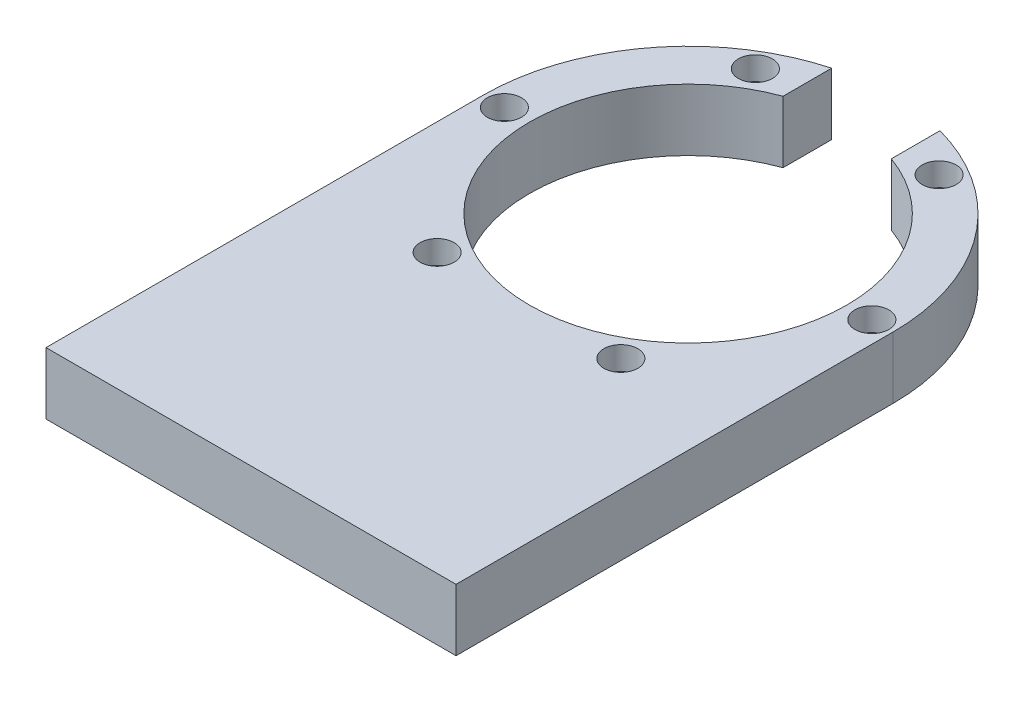
ISO-10303-21;
HEADER;
FILE_DESCRIPTION(('STEP AP214'),'2;1');
FILE_NAME('part.step','',(''),(''),'','','');
FILE_SCHEMA(('AUTOMOTIVE_DESIGN { 1 0 10303 214 1 1 1 1 }'));
ENDSEC;
DATA;
#1=APPLICATION_CONTEXT('core data for automotive mechanical design processes');
#2=APPLICATION_PROTOCOL_DEFINITION('international standard','automotive_design',2000,#1);
#3=PRODUCT_CONTEXT('',#1,'mechanical');
#4=PRODUCT('Part','Part','',(#3));
#5=PRODUCT_RELATED_PRODUCT_CATEGORY('part','',(#4));
#6=PRODUCT_DEFINITION_FORMATION('','',#4);
#7=PRODUCT_DEFINITION_CONTEXT('part definition',#1,'design');
#8=PRODUCT_DEFINITION('design','',#6,#7);
#9=PRODUCT_DEFINITION_SHAPE('','',#8);
#10=(LENGTH_UNIT() NAMED_UNIT(*) SI_UNIT(.MILLI.,.METRE.));
#11=(NAMED_UNIT(*) PLANE_ANGLE_UNIT() SI_UNIT($,.RADIAN.));
#12=(NAMED_UNIT(*) SI_UNIT($,.STERADIAN.) SOLID_ANGLE_UNIT());
#13=UNCERTAINTY_MEASURE_WITH_UNIT(LENGTH_MEASURE(1.E-05),#10,'distance_accuracy_value','');
#14=(GEOMETRIC_REPRESENTATION_CONTEXT(3) GLOBAL_UNCERTAINTY_ASSIGNED_CONTEXT((#13)) GLOBAL_UNIT_ASSIGNED_CONTEXT((#10,
#11,#12)) REPRESENTATION_CONTEXT('',''));
#15=CARTESIAN_POINT('',(0.,0.,0.));
#16=DIRECTION('',(0.,0.,1.));
#17=DIRECTION('',(1.,0.,0.));
#18=AXIS2_PLACEMENT_3D('',#15,#16,#17);
#19=CARTESIAN_POINT('',(11.875,0.,20.5681033398804));
#20=DIRECTION('',(0.,1.,0.));
#21=DIRECTION('',(0.,0.,1.));
#22=AXIS2_PLACEMENT_3D('',#19,#20,#21);
#23=CYLINDRICAL_SURFACE('',#22,1.25);
#24=CARTESIAN_POINT('',(11.875,0.,20.5681033398804));
#25=DIRECTION('',(0.,1.,0.));
#26=DIRECTION('',(0.,0.,1.));
#27=AXIS2_PLACEMENT_3D('',#24,#25,#26);
#28=CIRCLE('',#27,1.25);
#29=CARTESIAN_POINT('',(11.875,0.,21.8181033398804));
#30=VERTEX_POINT('',#29);
#31=EDGE_CURVE('E204',#30,#30,#28,.T.);
#32=ORIENTED_EDGE('',*,*,#31,.F.);
#33=EDGE_LOOP('',(#32));
#34=FACE_BOUND('',#33,.T.);
#35=CARTESIAN_POINT('',(11.875,5.,20.5681033398804));
#36=DIRECTION('',(0.,1.,0.));
#37=DIRECTION('',(0.,0.,1.));
#38=AXIS2_PLACEMENT_3D('',#35,#36,#37);
#39=CIRCLE('',#38,1.25);
#40=CARTESIAN_POINT('',(11.875,5.,21.8181033398804));
#41=VERTEX_POINT('',#40);
#42=EDGE_CURVE('E45',#41,#41,#39,.F.);
#43=ORIENTED_EDGE('',*,*,#42,.F.);
#44=EDGE_LOOP('',(#43));
#45=FACE_BOUND('',#44,.T.);
#46=ADVANCED_FACE('F41',(#34,#45),#23,.F.);
#47=CARTESIAN_POINT('',(-11.8750000000001,0.,20.5681033398804));
#48=DIRECTION('',(0.,1.,0.));
#49=DIRECTION('',(0.,0.,1.));
#50=AXIS2_PLACEMENT_3D('',#47,#48,#49);
#51=CYLINDRICAL_SURFACE('',#50,1.25);
#52=CARTESIAN_POINT('',(-11.8750000000001,0.,20.5681033398804));
#53=DIRECTION('',(0.,1.,0.));
#54=DIRECTION('',(0.,0.,1.));
#55=AXIS2_PLACEMENT_3D('',#52,#53,#54);
#56=CIRCLE('',#55,1.25);
#57=CARTESIAN_POINT('',(-11.8750000000001,0.,21.8181033398804));
#58=VERTEX_POINT('',#57);
#59=EDGE_CURVE('E207',#58,#58,#56,.T.);
#60=ORIENTED_EDGE('',*,*,#59,.F.);
#61=EDGE_LOOP('',(#60));
#62=FACE_BOUND('',#61,.T.);
#63=CARTESIAN_POINT('',(-11.8750000000001,5.,20.5681033398804));
#64=DIRECTION('',(0.,1.,0.));
#65=DIRECTION('',(0.,0.,1.));
#66=AXIS2_PLACEMENT_3D('',#63,#64,#65);
#67=CIRCLE('',#66,1.25);
#68=CARTESIAN_POINT('',(-11.8750000000001,5.,21.8181033398804));
#69=VERTEX_POINT('',#68);
#70=EDGE_CURVE('E187',#69,#69,#67,.F.);
#71=ORIENTED_EDGE('',*,*,#70,.F.);
#72=EDGE_LOOP('',(#71));
#73=FACE_BOUND('',#72,.T.);
#74=ADVANCED_FACE('F218',(#62,#73),#51,.F.);
#75=CARTESIAN_POINT('',(-23.75,0.,-1.65845363595049E-13));
#76=DIRECTION('',(0.,1.,0.));
#77=DIRECTION('',(0.,0.,1.));
#78=AXIS2_PLACEMENT_3D('',#75,#76,#77);
#79=CYLINDRICAL_SURFACE('',#78,1.25);
#80=CARTESIAN_POINT('',(-23.75,0.,-1.65845363595049E-13));
#81=DIRECTION('',(0.,1.,0.));
#82=DIRECTION('',(0.,0.,1.));
#83=AXIS2_PLACEMENT_3D('',#80,#81,#82);
#84=CIRCLE('',#83,1.25);
#85=CARTESIAN_POINT('',(-23.75,0.,1.24999999999984));
#86=VERTEX_POINT('',#85);
#87=EDGE_CURVE('E200',#86,#86,#84,.T.);
#88=ORIENTED_EDGE('',*,*,#87,.F.);
#89=EDGE_LOOP('',(#88));
#90=FACE_BOUND('',#89,.T.);
#91=CARTESIAN_POINT('',(-23.75,5.,-1.65845363595049E-13));
#92=DIRECTION('',(0.,1.,0.));
#93=DIRECTION('',(0.,0.,1.));
#94=AXIS2_PLACEMENT_3D('',#91,#92,#93);
#95=CIRCLE('',#94,1.25);
#96=CARTESIAN_POINT('',(-23.75,5.,1.24999999999984));
#97=VERTEX_POINT('',#96);
#98=EDGE_CURVE('E185',#97,#97,#95,.F.);
#99=ORIENTED_EDGE('',*,*,#98,.F.);
#100=EDGE_LOOP('',(#99));
#101=FACE_BOUND('',#100,.T.);
#102=ADVANCED_FACE('F214',(#90,#101),#79,.F.);
#103=CARTESIAN_POINT('',(-11.8749999999998,0.,-20.5681033398805));
#104=DIRECTION('',(0.,1.,0.));
#105=DIRECTION('',(0.,0.,1.));
#106=AXIS2_PLACEMENT_3D('',#103,#104,#105);
#107=CYLINDRICAL_SURFACE('',#106,1.25);
#108=CARTESIAN_POINT('',(-11.8749999999998,0.,-20.5681033398805));
#109=DIRECTION('',(0.,1.,0.));
#110=DIRECTION('',(0.,0.,1.));
#111=AXIS2_PLACEMENT_3D('',#108,#109,#110);
#112=CIRCLE('',#111,1.25);
#113=CARTESIAN_POINT('',(-11.8749999999998,0.,-19.3181033398805));
#114=VERTEX_POINT('',#113);
#115=EDGE_CURVE('E140',#114,#114,#112,.T.);
#116=ORIENTED_EDGE('',*,*,#115,.F.);
#117=EDGE_LOOP('',(#116));
#118=FACE_BOUND('',#117,.T.);
#119=CARTESIAN_POINT('',(-11.8749999999998,5.,-20.5681033398805));
#120=DIRECTION('',(0.,1.,0.));
#121=DIRECTION('',(0.,0.,1.));
#122=AXIS2_PLACEMENT_3D('',#119,#120,#121);
#123=CIRCLE('',#122,1.25);
#124=CARTESIAN_POINT('',(-11.8749999999998,5.,-19.3181033398805));
#125=VERTEX_POINT('',#124);
#126=EDGE_CURVE('E182',#125,#125,#123,.F.);
#127=ORIENTED_EDGE('',*,*,#126,.F.);
#128=EDGE_LOOP('',(#127));
#129=FACE_BOUND('',#128,.T.);
#130=ADVANCED_FACE('F217',(#118,#129),#107,.F.);
#131=CARTESIAN_POINT('',(11.8750000000002,0.,-20.5681033398803));
#132=DIRECTION('',(0.,1.,0.));
#133=DIRECTION('',(0.,0.,1.));
#134=AXIS2_PLACEMENT_3D('',#131,#132,#133);
#135=CYLINDRICAL_SURFACE('',#134,1.25);
#136=CARTESIAN_POINT('',(11.8750000000002,0.,-20.5681033398803));
#137=DIRECTION('',(0.,1.,0.));
#138=DIRECTION('',(0.,0.,1.));
#139=AXIS2_PLACEMENT_3D('',#136,#137,#138);
#140=CIRCLE('',#139,1.25);
#141=CARTESIAN_POINT('',(11.8750000000002,0.,-19.3181033398803));
#142=VERTEX_POINT('',#141);
#143=EDGE_CURVE('E192',#142,#142,#140,.T.);
#144=ORIENTED_EDGE('',*,*,#143,.F.);
#145=EDGE_LOOP('',(#144));
#146=FACE_BOUND('',#145,.T.);
#147=CARTESIAN_POINT('',(11.8750000000002,5.,-20.5681033398803));
#148=DIRECTION('',(0.,1.,0.));
#149=DIRECTION('',(0.,0.,1.));
#150=AXIS2_PLACEMENT_3D('',#147,#148,#149);
#151=CIRCLE('',#150,1.25);
#152=CARTESIAN_POINT('',(11.8750000000002,5.,-19.3181033398803));
#153=VERTEX_POINT('',#152);
#154=EDGE_CURVE('E178',#153,#153,#151,.F.);
#155=ORIENTED_EDGE('',*,*,#154,.F.);
#156=EDGE_LOOP('',(#155));
#157=FACE_BOUND('',#156,.T.);
#158=ADVANCED_FACE('F251',(#146,#157),#135,.F.);
#159=CARTESIAN_POINT('',(23.75,0.,0.));
#160=DIRECTION('',(0.,1.,0.));
#161=DIRECTION('',(0.,0.,1.));
#162=AXIS2_PLACEMENT_3D('',#159,#160,#161);
#163=CYLINDRICAL_SURFACE('',#162,1.25);
#164=CARTESIAN_POINT('',(23.75,0.,0.));
#165=DIRECTION('',(0.,1.,0.));
#166=DIRECTION('',(0.,0.,1.));
#167=AXIS2_PLACEMENT_3D('',#164,#165,#166);
#168=CIRCLE('',#167,1.25);
#169=CARTESIAN_POINT('',(23.75,0.,1.25));
#170=VERTEX_POINT('',#169);
#171=EDGE_CURVE('E147',#170,#170,#168,.T.);
#172=ORIENTED_EDGE('',*,*,#171,.F.);
#173=EDGE_LOOP('',(#172));
#174=FACE_BOUND('',#173,.T.);
#175=CARTESIAN_POINT('',(23.75,5.,0.));
#176=DIRECTION('',(0.,1.,0.));
#177=DIRECTION('',(0.,0.,1.));
#178=AXIS2_PLACEMENT_3D('',#175,#176,#177);
#179=CIRCLE('',#178,1.25);
#180=CARTESIAN_POINT('',(23.75,5.,1.25));
#181=VERTEX_POINT('',#180);
#182=EDGE_CURVE('E175',#181,#181,#179,.F.);
#183=ORIENTED_EDGE('',*,*,#182,.F.);
#184=EDGE_LOOP('',(#183));
#185=FACE_BOUND('',#184,.T.);
#186=ADVANCED_FACE('F304',(#174,#185),#163,.F.);
#187=CARTESIAN_POINT('',(0.,8.,0.));
#188=DIRECTION('',(0.,-1.,0.));
#189=DIRECTION('',(0.,0.,-1.));
#190=AXIS2_PLACEMENT_3D('',#187,#188,#189);
#191=CYLINDRICAL_SURFACE('',#190,26.5);
#192=DIRECTION('',(0.,1.,0.));
#193=VECTOR('',#192,1.);
#194=CARTESIAN_POINT('',(-26.5,0.,1.85048510958686E-13));
#195=LINE('',#194,#193);
#196=CARTESIAN_POINT('',(-26.5,0.,0.));
#197=VERTEX_POINT('',#196);
#198=CARTESIAN_POINT('',(-26.5,8.,0.));
#199=VERTEX_POINT('',#198);
#200=EDGE_CURVE('E66',#197,#199,#195,.T.);
#201=ORIENTED_EDGE('',*,*,#200,.T.);
#202=CARTESIAN_POINT('',(0.,8.,0.));
#203=DIRECTION('',(0.,1.,0.));
#204=DIRECTION('',(0.,0.,1.));
#205=AXIS2_PLACEMENT_3D('',#202,#203,#204);
#206=CIRCLE('',#205,26.5);
#207=CARTESIAN_POINT('',(-7.,8.,-25.5587558382641));
#208=VERTEX_POINT('',#207);
#209=EDGE_CURVE('E171',#208,#199,#206,.T.);
#210=ORIENTED_EDGE('',*,*,#209,.F.);
#211=DIRECTION('',(0.,-1.,0.));
#212=VECTOR('',#211,1.);
#213=CARTESIAN_POINT('',(-7.,8.,-25.5587558382641));
#214=LINE('',#213,#212);
#215=CARTESIAN_POINT('',(-7.,0.,-25.5587558382641));
#216=VERTEX_POINT('',#215);
#217=EDGE_CURVE('E164',#208,#216,#214,.T.);
#218=ORIENTED_EDGE('',*,*,#217,.T.);
#219=CARTESIAN_POINT('',(0.,0.,0.));
#220=DIRECTION('',(0.,1.,0.));
#221=DIRECTION('',(0.,0.,1.));
#222=AXIS2_PLACEMENT_3D('',#219,#220,#221);
#223=CIRCLE('',#222,26.5);
#224=EDGE_CURVE('E119',#216,#197,#223,.T.);
#225=ORIENTED_EDGE('',*,*,#224,.T.);
#226=EDGE_LOOP('',(#201,#210,#218,#225));
#227=FACE_BOUND('',#226,.T.);
#228=ADVANCED_FACE('F306',(#227),#191,.T.);
#229=CARTESIAN_POINT('',(26.5,8.,0.));
#230=VERTEX_POINT('',#229);
#231=CARTESIAN_POINT('',(7.,8.,-25.5587558382641));
#232=VERTEX_POINT('',#231);
#233=EDGE_CURVE('E58',#230,#232,#206,.T.);
#234=ORIENTED_EDGE('',*,*,#233,.F.);
#235=DIRECTION('',(0.,1.,0.));
#236=VECTOR('',#235,1.);
#237=CARTESIAN_POINT('',(26.5,0.,0.));
#238=LINE('',#237,#236);
#239=CARTESIAN_POINT('',(26.5,0.,0.));
#240=VERTEX_POINT('',#239);
#241=EDGE_CURVE('E123',#240,#230,#238,.T.);
#242=ORIENTED_EDGE('',*,*,#241,.F.);
#243=CARTESIAN_POINT('',(7.,0.,-25.5587558382641));
#244=VERTEX_POINT('',#243);
#245=EDGE_CURVE('E109',#240,#244,#223,.T.);
#246=ORIENTED_EDGE('',*,*,#245,.T.);
#247=DIRECTION('',(0.,-1.,0.));
#248=VECTOR('',#247,1.);
#249=CARTESIAN_POINT('',(7.,8.,-25.5587558382641));
#250=LINE('',#249,#248);
#251=EDGE_CURVE('E159',#244,#232,#250,.F.);
#252=ORIENTED_EDGE('',*,*,#251,.T.);
#253=EDGE_LOOP('',(#234,#242,#246,#252));
#254=FACE_BOUND('',#253,.T.);
#255=ADVANCED_FACE('F43',(#254),#191,.T.);
#256=CARTESIAN_POINT('',(0.,8.,0.));
#257=DIRECTION('',(0.,1.,0.));
#258=DIRECTION('',(0.,0.,1.));
#259=AXIS2_PLACEMENT_3D('',#256,#257,#258);
#260=PLANE('',#259);
#261=CARTESIAN_POINT('',(23.75,8.,0.));
#262=DIRECTION('',(0.,1.,0.));
#263=DIRECTION('',(0.,0.,1.));
#264=AXIS2_PLACEMENT_3D('',#261,#262,#263);
#265=CIRCLE('',#264,2.2);
#266=CARTESIAN_POINT('',(23.75,8.,2.2));
#267=VERTEX_POINT('',#266);
#268=EDGE_CURVE('E374',#267,#267,#265,.T.);
#269=ORIENTED_EDGE('',*,*,#268,.F.);
#270=EDGE_LOOP('',(#269));
#271=FACE_BOUND('',#270,.T.);
#272=CARTESIAN_POINT('',(11.8750000000002,8.,-20.5681033398803));
#273=DIRECTION('',(0.,1.,0.));
#274=DIRECTION('',(0.,0.,1.));
#275=AXIS2_PLACEMENT_3D('',#272,#273,#274);
#276=CIRCLE('',#275,2.2);
#277=CARTESIAN_POINT('',(11.8750000000002,8.,-18.3681033398803));
#278=VERTEX_POINT('',#277);
#279=EDGE_CURVE('E364',#278,#278,#276,.T.);
#280=ORIENTED_EDGE('',*,*,#279,.F.);
#281=EDGE_LOOP('',(#280));
#282=FACE_BOUND('',#281,.T.);
#283=CARTESIAN_POINT('',(-11.8749999999998,8.,-20.5681033398805));
#284=DIRECTION('',(0.,1.,0.));
#285=DIRECTION('',(0.,0.,1.));
#286=AXIS2_PLACEMENT_3D('',#283,#284,#285);
#287=CIRCLE('',#286,2.2);
#288=CARTESIAN_POINT('',(-11.8749999999998,8.,-18.3681033398805));
#289=VERTEX_POINT('',#288);
#290=EDGE_CURVE('E361',#289,#289,#287,.T.);
#291=ORIENTED_EDGE('',*,*,#290,.F.);
#292=EDGE_LOOP('',(#291));
#293=FACE_BOUND('',#292,.T.);
#294=CARTESIAN_POINT('',(-23.75,8.,-1.65845363595049E-13));
#295=DIRECTION('',(0.,1.,0.));
#296=DIRECTION('',(0.,0.,1.));
#297=AXIS2_PLACEMENT_3D('',#294,#295,#296);
#298=CIRCLE('',#297,2.2);
#299=CARTESIAN_POINT('',(-23.75,8.,2.19999999999984));
#300=VERTEX_POINT('',#299);
#301=EDGE_CURVE('E350',#300,#300,#298,.T.);
#302=ORIENTED_EDGE('',*,*,#301,.F.);
#303=EDGE_LOOP('',(#302));
#304=FACE_BOUND('',#303,.T.);
#305=CARTESIAN_POINT('',(-11.8750000000001,8.,20.5681033398804));
#306=DIRECTION('',(0.,1.,0.));
#307=DIRECTION('',(0.,0.,1.));
#308=AXIS2_PLACEMENT_3D('',#305,#306,#307);
#309=CIRCLE('',#308,2.2);
#310=CARTESIAN_POINT('',(-11.8750000000001,8.,22.7681033398804));
#311=VERTEX_POINT('',#310);
#312=EDGE_CURVE('E349',#311,#311,#309,.T.);
#313=ORIENTED_EDGE('',*,*,#312,.F.);
#314=EDGE_LOOP('',(#313));
#315=FACE_BOUND('',#314,.T.);
#316=CARTESIAN_POINT('',(11.875,8.,20.5681033398804));
#317=DIRECTION('',(0.,1.,0.));
#318=DIRECTION('',(0.,0.,1.));
#319=AXIS2_PLACEMENT_3D('',#316,#317,#318);
#320=CIRCLE('',#319,2.2);
#321=CARTESIAN_POINT('',(11.875,8.,22.7681033398804));
#322=VERTEX_POINT('',#321);
#323=EDGE_CURVE('E377',#322,#322,#320,.T.);
#324=ORIENTED_EDGE('',*,*,#323,.F.);
#325=EDGE_LOOP('',(#324));
#326=FACE_BOUND('',#325,.T.);
#327=DIRECTION('',(0.,0.,1.));
#328=VECTOR('',#327,1.);
#329=CARTESIAN_POINT('',(-7.,8.,-27.7228900982159));
#330=LINE('',#329,#328);
#331=CARTESIAN_POINT('',(-7.,8.,-19.2678488679977));
#332=VERTEX_POINT('',#331);
#333=EDGE_CURVE('E126',#208,#332,#330,.T.);
#334=ORIENTED_EDGE('',*,*,#333,.F.);
#335=ORIENTED_EDGE('',*,*,#209,.T.);
#336=DIRECTION('',(0.,0.,1.));
#337=VECTOR('',#336,1.);
#338=CARTESIAN_POINT('',(-26.5,8.,1.85048510958686E-13));
#339=LINE('',#338,#337);
#340=CARTESIAN_POINT('',(-26.5,8.,56.5));
#341=VERTEX_POINT('',#340);
#342=EDGE_CURVE('E132',#199,#341,#339,.T.);
#343=ORIENTED_EDGE('',*,*,#342,.T.);
#344=DIRECTION('',(1.,0.,0.));
#345=VECTOR('',#344,1.);
#346=CARTESIAN_POINT('',(-26.5,8.,56.5));
#347=LINE('',#346,#345);
#348=CARTESIAN_POINT('',(26.5,8.,56.5));
#349=VERTEX_POINT('',#348);
#350=EDGE_CURVE('E137',#341,#349,#347,.T.);
#351=ORIENTED_EDGE('',*,*,#350,.T.);
#352=DIRECTION('',(0.,0.,1.));
#353=VECTOR('',#352,1.);
#354=CARTESIAN_POINT('',(26.5,8.,0.));
#355=LINE('',#354,#353);
#356=EDGE_CURVE('E145',#230,#349,#355,.T.);
#357=ORIENTED_EDGE('',*,*,#356,.F.);
#358=ORIENTED_EDGE('',*,*,#233,.T.);
#359=DIRECTION('',(0.,0.,-1.));
#360=VECTOR('',#359,1.);
#361=CARTESIAN_POINT('',(7.,8.,-27.7228900982159));
#362=LINE('',#361,#360);
#363=CARTESIAN_POINT('',(7.,8.,-19.2678488679977));
#364=VERTEX_POINT('',#363);
#365=EDGE_CURVE('E155',#364,#232,#362,.T.);
#366=ORIENTED_EDGE('',*,*,#365,.F.);
#367=CARTESIAN_POINT('',(0.,8.,0.));
#368=DIRECTION('',(0.,1.,0.));
#369=DIRECTION('',(0.,0.,1.));
#370=AXIS2_PLACEMENT_3D('',#367,#368,#369);
#371=CIRCLE('',#370,20.5);
#372=EDGE_CURVE('E167',#332,#364,#371,.T.);
#373=ORIENTED_EDGE('',*,*,#372,.F.);
#374=EDGE_LOOP('',(#334,#335,#343,#351,#357,#358,#366,#373));
#375=FACE_BOUND('',#374,.T.);
#376=ADVANCED_FACE('F280',(#271,#282,#293,#304,#315,#326,#375),#260,.T.);
#377=CARTESIAN_POINT('',(0.,0.,0.));
#378=DIRECTION('',(0.,1.,0.));
#379=DIRECTION('',(0.,0.,1.));
#380=AXIS2_PLACEMENT_3D('',#377,#378,#379);
#381=PLANE('',#380);
#382=ORIENTED_EDGE('',*,*,#171,.T.);
#383=EDGE_LOOP('',(#382));
#384=FACE_BOUND('',#383,.T.);
#385=ORIENTED_EDGE('',*,*,#143,.T.);
#386=EDGE_LOOP('',(#385));
#387=FACE_BOUND('',#386,.T.);
#388=ORIENTED_EDGE('',*,*,#115,.T.);
#389=EDGE_LOOP('',(#388));
#390=FACE_BOUND('',#389,.T.);
#391=ORIENTED_EDGE('',*,*,#87,.T.);
#392=EDGE_LOOP('',(#391));
#393=FACE_BOUND('',#392,.T.);
#394=ORIENTED_EDGE('',*,*,#59,.T.);
#395=EDGE_LOOP('',(#394));
#396=FACE_BOUND('',#395,.T.);
#397=ORIENTED_EDGE('',*,*,#31,.T.);
#398=EDGE_LOOP('',(#397));
#399=FACE_BOUND('',#398,.T.);
#400=ORIENTED_EDGE('',*,*,#224,.F.);
#401=DIRECTION('',(0.,0.,1.));
#402=VECTOR('',#401,1.);
#403=CARTESIAN_POINT('',(-7.,0.,0.));
#404=LINE('',#403,#402);
#405=CARTESIAN_POINT('',(-7.,0.,-19.2678488679977));
#406=VERTEX_POINT('',#405);
#407=EDGE_CURVE('E161',#216,#406,#404,.T.);
#408=ORIENTED_EDGE('',*,*,#407,.T.);
#409=CARTESIAN_POINT('',(0.,0.,0.));
#410=DIRECTION('',(0.,1.,0.));
#411=DIRECTION('',(0.,0.,1.));
#412=AXIS2_PLACEMENT_3D('',#409,#410,#411);
#413=CIRCLE('',#412,20.5);
#414=CARTESIAN_POINT('',(7.,0.,-19.2678488679977));
#415=VERTEX_POINT('',#414);
#416=EDGE_CURVE('E120',#406,#415,#413,.T.);
#417=ORIENTED_EDGE('',*,*,#416,.T.);
#418=DIRECTION('',(0.,0.,-1.));
#419=VECTOR('',#418,1.);
#420=CARTESIAN_POINT('',(7.,0.,0.));
#421=LINE('',#420,#419);
#422=EDGE_CURVE('E117',#415,#244,#421,.T.);
#423=ORIENTED_EDGE('',*,*,#422,.T.);
#424=ORIENTED_EDGE('',*,*,#245,.F.);
#425=DIRECTION('',(0.,0.,1.));
#426=VECTOR('',#425,1.);
#427=CARTESIAN_POINT('',(26.5,0.,0.));
#428=LINE('',#427,#426);
#429=CARTESIAN_POINT('',(26.5,0.,56.5));
#430=VERTEX_POINT('',#429);
#431=EDGE_CURVE('E114',#240,#430,#428,.T.);
#432=ORIENTED_EDGE('',*,*,#431,.T.);
#433=DIRECTION('',(1.,0.,0.));
#434=VECTOR('',#433,1.);
#435=CARTESIAN_POINT('',(-26.5,0.,56.5));
#436=LINE('',#435,#434);
#437=CARTESIAN_POINT('',(-26.5,0.,56.5));
#438=VERTEX_POINT('',#437);
#439=EDGE_CURVE('E131',#438,#430,#436,.T.);
#440=ORIENTED_EDGE('',*,*,#439,.F.);
#441=DIRECTION('',(0.,0.,1.));
#442=VECTOR('',#441,1.);
#443=CARTESIAN_POINT('',(-26.5,0.,1.85048510958686E-13));
#444=LINE('',#443,#442);
#445=EDGE_CURVE('E134',#197,#438,#444,.T.);
#446=ORIENTED_EDGE('',*,*,#445,.F.);
#447=EDGE_LOOP('',(#400,#408,#417,#423,#424,#432,#440,#446));
#448=FACE_BOUND('',#447,.T.);
#449=ADVANCED_FACE('F111',(#384,#387,#390,#393,#396,#399,#448),#381,.F.);
#450=CARTESIAN_POINT('',(0.,0.,0.));
#451=DIRECTION('',(0.,1.,0.));
#452=DIRECTION('',(0.,0.,1.));
#453=AXIS2_PLACEMENT_3D('',#450,#451,#452);
#454=CYLINDRICAL_SURFACE('',#453,20.5);
#455=ORIENTED_EDGE('',*,*,#416,.F.);
#456=DIRECTION('',(0.,1.,0.));
#457=VECTOR('',#456,1.);
#458=CARTESIAN_POINT('',(-7.,0.,-19.2678488679977));
#459=LINE('',#458,#457);
#460=EDGE_CURVE('E11',#406,#332,#459,.T.);
#461=ORIENTED_EDGE('',*,*,#460,.T.);
#462=ORIENTED_EDGE('',*,*,#372,.T.);
#463=DIRECTION('',(0.,1.,0.));
#464=VECTOR('',#463,1.);
#465=CARTESIAN_POINT('',(7.,0.,-19.2678488679977));
#466=LINE('',#465,#464);
#467=EDGE_CURVE('E50',#364,#415,#466,.F.);
#468=ORIENTED_EDGE('',*,*,#467,.T.);
#469=EDGE_LOOP('',(#455,#461,#462,#468));
#470=FACE_BOUND('',#469,.T.);
#471=ADVANCED_FACE('F272',(#470),#454,.F.);
#472=CARTESIAN_POINT('',(7.,-7.,-27.7228900982159));
#473=DIRECTION('',(1.,0.,0.));
#474=DIRECTION('',(0.,0.,-1.));
#475=AXIS2_PLACEMENT_3D('',#472,#473,#474);
#476=PLANE('',#475);
#477=ORIENTED_EDGE('',*,*,#422,.F.);
#478=ORIENTED_EDGE('',*,*,#467,.F.);
#479=ORIENTED_EDGE('',*,*,#365,.T.);
#480=ORIENTED_EDGE('',*,*,#251,.F.);
#481=EDGE_LOOP('',(#477,#478,#479,#480));
#482=FACE_BOUND('',#481,.T.);
#483=ADVANCED_FACE('F269',(#482),#476,.F.);
#484=CARTESIAN_POINT('',(-7.,-7.,-27.7228900982159));
#485=DIRECTION('',(-1.,0.,0.));
#486=DIRECTION('',(0.,0.,1.));
#487=AXIS2_PLACEMENT_3D('',#484,#485,#486);
#488=PLANE('',#487);
#489=ORIENTED_EDGE('',*,*,#333,.T.);
#490=ORIENTED_EDGE('',*,*,#460,.F.);
#491=ORIENTED_EDGE('',*,*,#407,.F.);
#492=ORIENTED_EDGE('',*,*,#217,.F.);
#493=EDGE_LOOP('',(#489,#490,#491,#492));
#494=FACE_BOUND('',#493,.T.);
#495=ADVANCED_FACE('F268',(#494),#488,.F.);
#496=CARTESIAN_POINT('',(26.5,0.,0.));
#497=DIRECTION('',(-1.,0.,0.));
#498=DIRECTION('',(0.,0.,1.));
#499=AXIS2_PLACEMENT_3D('',#496,#497,#498);
#500=PLANE('',#499);
#501=ORIENTED_EDGE('',*,*,#356,.T.);
#502=DIRECTION('',(0.,1.,0.));
#503=VECTOR('',#502,1.);
#504=CARTESIAN_POINT('',(26.5,0.,56.5));
#505=LINE('',#504,#503);
#506=EDGE_CURVE('E127',#430,#349,#505,.T.);
#507=ORIENTED_EDGE('',*,*,#506,.F.);
#508=ORIENTED_EDGE('',*,*,#431,.F.);
#509=ORIENTED_EDGE('',*,*,#241,.T.);
#510=EDGE_LOOP('',(#501,#507,#508,#509));
#511=FACE_BOUND('',#510,.T.);
#512=ADVANCED_FACE('F129',(#511),#500,.F.);
#513=CARTESIAN_POINT('',(-26.5,0.,56.5));
#514=DIRECTION('',(0.,0.,1.));
#515=DIRECTION('',(1.,0.,0.));
#516=AXIS2_PLACEMENT_3D('',#513,#514,#515);
#517=PLANE('',#516);
#518=ORIENTED_EDGE('',*,*,#350,.F.);
#519=DIRECTION('',(0.,1.,0.));
#520=VECTOR('',#519,1.);
#521=CARTESIAN_POINT('',(-26.5,0.,56.5));
#522=LINE('',#521,#520);
#523=EDGE_CURVE('E151',#438,#341,#522,.T.);
#524=ORIENTED_EDGE('',*,*,#523,.F.);
#525=ORIENTED_EDGE('',*,*,#439,.T.);
#526=ORIENTED_EDGE('',*,*,#506,.T.);
#527=EDGE_LOOP('',(#518,#524,#525,#526));
#528=FACE_BOUND('',#527,.T.);
#529=ADVANCED_FACE('F261',(#528),#517,.T.);
#530=CARTESIAN_POINT('',(-26.5,0.,1.85048510958686E-13));
#531=DIRECTION('',(-1.,0.,0.));
#532=DIRECTION('',(0.,0.,1.));
#533=AXIS2_PLACEMENT_3D('',#530,#531,#532);
#534=PLANE('',#533);
#535=ORIENTED_EDGE('',*,*,#342,.F.);
#536=ORIENTED_EDGE('',*,*,#200,.F.);
#537=ORIENTED_EDGE('',*,*,#445,.T.);
#538=ORIENTED_EDGE('',*,*,#523,.T.);
#539=EDGE_LOOP('',(#535,#536,#537,#538));
#540=FACE_BOUND('',#539,.T.);
#541=ADVANCED_FACE('F257',(#540),#534,.T.);
#542=CARTESIAN_POINT('',(23.75,5.,0.));
#543=DIRECTION('',(0.,1.,0.));
#544=DIRECTION('',(0.,0.,1.));
#545=AXIS2_PLACEMENT_3D('',#542,#543,#544);
#546=PLANE('',#545);
#547=CARTESIAN_POINT('',(23.75,5.,0.));
#548=DIRECTION('',(0.,1.,0.));
#549=DIRECTION('',(0.,0.,1.));
#550=AXIS2_PLACEMENT_3D('',#547,#548,#549);
#551=CIRCLE('',#550,2.2);
#552=CARTESIAN_POINT('',(23.75,5.,2.2));
#553=VERTEX_POINT('',#552);
#554=EDGE_CURVE('E179',#553,#553,#551,.T.);
#555=ORIENTED_EDGE('',*,*,#554,.T.);
#556=EDGE_LOOP('',(#555));
#557=FACE_BOUND('',#556,.T.);
#558=ORIENTED_EDGE('',*,*,#182,.T.);
#559=EDGE_LOOP('',(#558));
#560=FACE_BOUND('',#559,.T.);
#561=ADVANCED_FACE('F260',(#557,#560),#546,.T.);
#562=CARTESIAN_POINT('',(23.75,5.,0.));
#563=DIRECTION('',(0.,1.,0.));
#564=DIRECTION('',(0.,0.,1.));
#565=AXIS2_PLACEMENT_3D('',#562,#563,#564);
#566=CYLINDRICAL_SURFACE('',#565,2.2);
#567=ORIENTED_EDGE('',*,*,#554,.F.);
#568=EDGE_LOOP('',(#567));
#569=FACE_BOUND('',#568,.T.);
#570=ORIENTED_EDGE('',*,*,#268,.T.);
#571=EDGE_LOOP('',(#570));
#572=FACE_BOUND('',#571,.T.);
#573=ADVANCED_FACE('F317',(#569,#572),#566,.F.);
#574=CARTESIAN_POINT('',(11.8750000000002,5.,-20.5681033398803));
#575=DIRECTION('',(0.,1.,0.));
#576=DIRECTION('',(0.,0.,1.));
#577=AXIS2_PLACEMENT_3D('',#574,#575,#576);
#578=PLANE('',#577);
#579=CARTESIAN_POINT('',(11.8750000000002,5.,-20.5681033398803));
#580=DIRECTION('',(0.,1.,0.));
#581=DIRECTION('',(0.,0.,1.));
#582=AXIS2_PLACEMENT_3D('',#579,#580,#581);
#583=CIRCLE('',#582,2.2);
#584=CARTESIAN_POINT('',(11.8750000000002,5.,-18.3681033398803));
#585=VERTEX_POINT('',#584);
#586=EDGE_CURVE('E367',#585,#585,#583,.T.);
#587=ORIENTED_EDGE('',*,*,#586,.T.);
#588=EDGE_LOOP('',(#587));
#589=FACE_BOUND('',#588,.T.);
#590=ORIENTED_EDGE('',*,*,#154,.T.);
#591=EDGE_LOOP('',(#590));
#592=FACE_BOUND('',#591,.T.);
#593=ADVANCED_FACE('F300',(#589,#592),#578,.T.);
#594=CARTESIAN_POINT('',(11.8750000000002,5.,-20.5681033398803));
#595=DIRECTION('',(0.,1.,0.));
#596=DIRECTION('',(0.,0.,1.));
#597=AXIS2_PLACEMENT_3D('',#594,#595,#596);
#598=CYLINDRICAL_SURFACE('',#597,2.2);
#599=ORIENTED_EDGE('',*,*,#586,.F.);
#600=EDGE_LOOP('',(#599));
#601=FACE_BOUND('',#600,.T.);
#602=ORIENTED_EDGE('',*,*,#279,.T.);
#603=EDGE_LOOP('',(#602));
#604=FACE_BOUND('',#603,.T.);
#605=ADVANCED_FACE('F294',(#601,#604),#598,.F.);
#606=CARTESIAN_POINT('',(-11.8749999999998,5.,-20.5681033398805));
#607=DIRECTION('',(0.,1.,0.));
#608=DIRECTION('',(0.,0.,1.));
#609=AXIS2_PLACEMENT_3D('',#606,#607,#608);
#610=PLANE('',#609);
#611=CARTESIAN_POINT('',(-11.8749999999998,5.,-20.5681033398805));
#612=DIRECTION('',(0.,1.,0.));
#613=DIRECTION('',(0.,0.,1.));
#614=AXIS2_PLACEMENT_3D('',#611,#612,#613);
#615=CIRCLE('',#614,2.2);
#616=CARTESIAN_POINT('',(-11.8749999999998,5.,-18.3681033398805));
#617=VERTEX_POINT('',#616);
#618=EDGE_CURVE('E363',#617,#617,#615,.T.);
#619=ORIENTED_EDGE('',*,*,#618,.T.);
#620=EDGE_LOOP('',(#619));
#621=FACE_BOUND('',#620,.T.);
#622=ORIENTED_EDGE('',*,*,#126,.T.);
#623=EDGE_LOOP('',(#622));
#624=FACE_BOUND('',#623,.T.);
#625=ADVANCED_FACE('F235',(#621,#624),#610,.T.);
#626=CARTESIAN_POINT('',(-11.8749999999998,5.,-20.5681033398805));
#627=DIRECTION('',(0.,1.,0.));
#628=DIRECTION('',(0.,0.,1.));
#629=AXIS2_PLACEMENT_3D('',#626,#627,#628);
#630=CYLINDRICAL_SURFACE('',#629,2.2);
#631=ORIENTED_EDGE('',*,*,#618,.F.);
#632=EDGE_LOOP('',(#631));
#633=FACE_BOUND('',#632,.T.);
#634=ORIENTED_EDGE('',*,*,#290,.T.);
#635=EDGE_LOOP('',(#634));
#636=FACE_BOUND('',#635,.T.);
#637=ADVANCED_FACE('F225',(#633,#636),#630,.F.);
#638=CARTESIAN_POINT('',(-23.75,5.,-1.65845363595049E-13));
#639=DIRECTION('',(0.,1.,0.));
#640=DIRECTION('',(0.,0.,1.));
#641=AXIS2_PLACEMENT_3D('',#638,#639,#640);
#642=PLANE('',#641);
#643=CARTESIAN_POINT('',(-23.75,5.,-1.65845363595049E-13));
#644=DIRECTION('',(0.,1.,0.));
#645=DIRECTION('',(0.,0.,1.));
#646=AXIS2_PLACEMENT_3D('',#643,#644,#645);
#647=CIRCLE('',#646,2.2);
#648=CARTESIAN_POINT('',(-23.75,5.,2.19999999999984));
#649=VERTEX_POINT('',#648);
#650=EDGE_CURVE('E356',#649,#649,#647,.T.);
#651=ORIENTED_EDGE('',*,*,#650,.T.);
#652=EDGE_LOOP('',(#651));
#653=FACE_BOUND('',#652,.T.);
#654=ORIENTED_EDGE('',*,*,#98,.T.);
#655=EDGE_LOOP('',(#654));
#656=FACE_BOUND('',#655,.T.);
#657=ADVANCED_FACE('F222',(#653,#656),#642,.T.);
#658=CARTESIAN_POINT('',(-23.75,5.,-1.65845363595049E-13));
#659=DIRECTION('',(0.,1.,0.));
#660=DIRECTION('',(0.,0.,1.));
#661=AXIS2_PLACEMENT_3D('',#658,#659,#660);
#662=CYLINDRICAL_SURFACE('',#661,2.2);
#663=ORIENTED_EDGE('',*,*,#650,.F.);
#664=EDGE_LOOP('',(#663));
#665=FACE_BOUND('',#664,.T.);
#666=ORIENTED_EDGE('',*,*,#301,.T.);
#667=EDGE_LOOP('',(#666));
#668=FACE_BOUND('',#667,.T.);
#669=ADVANCED_FACE('F224',(#665,#668),#662,.F.);
#670=CARTESIAN_POINT('',(-11.8750000000001,5.,20.5681033398804));
#671=DIRECTION('',(0.,1.,0.));
#672=DIRECTION('',(0.,0.,1.));
#673=AXIS2_PLACEMENT_3D('',#670,#671,#672);
#674=PLANE('',#673);
#675=CARTESIAN_POINT('',(-11.8750000000001,5.,20.5681033398804));
#676=DIRECTION('',(0.,1.,0.));
#677=DIRECTION('',(0.,0.,1.));
#678=AXIS2_PLACEMENT_3D('',#675,#676,#677);
#679=CIRCLE('',#678,2.2);
#680=CARTESIAN_POINT('',(-11.8750000000001,5.,22.7681033398804));
#681=VERTEX_POINT('',#680);
#682=EDGE_CURVE('E348',#681,#681,#679,.T.);
#683=ORIENTED_EDGE('',*,*,#682,.T.);
#684=EDGE_LOOP('',(#683));
#685=FACE_BOUND('',#684,.T.);
#686=ORIENTED_EDGE('',*,*,#70,.T.);
#687=EDGE_LOOP('',(#686));
#688=FACE_BOUND('',#687,.T.);
#689=ADVANCED_FACE('F232',(#685,#688),#674,.T.);
#690=CARTESIAN_POINT('',(-11.8750000000001,5.,20.5681033398804));
#691=DIRECTION('',(0.,1.,0.));
#692=DIRECTION('',(0.,0.,1.));
#693=AXIS2_PLACEMENT_3D('',#690,#691,#692);
#694=CYLINDRICAL_SURFACE('',#693,2.2);
#695=ORIENTED_EDGE('',*,*,#682,.F.);
#696=EDGE_LOOP('',(#695));
#697=FACE_BOUND('',#696,.T.);
#698=ORIENTED_EDGE('',*,*,#312,.T.);
#699=EDGE_LOOP('',(#698));
#700=FACE_BOUND('',#699,.T.);
#701=ADVANCED_FACE('F337',(#697,#700),#694,.F.);
#702=CARTESIAN_POINT('',(11.875,5.,20.5681033398804));
#703=DIRECTION('',(0.,1.,0.));
#704=DIRECTION('',(0.,0.,1.));
#705=AXIS2_PLACEMENT_3D('',#702,#703,#704);
#706=PLANE('',#705);
#707=CARTESIAN_POINT('',(11.875,5.,20.5681033398804));
#708=DIRECTION('',(0.,1.,0.));
#709=DIRECTION('',(0.,0.,1.));
#710=AXIS2_PLACEMENT_3D('',#707,#708,#709);
#711=CIRCLE('',#710,2.2);
#712=CARTESIAN_POINT('',(11.875,5.,22.7681033398804));
#713=VERTEX_POINT('',#712);
#714=EDGE_CURVE('E353',#713,#713,#711,.T.);
#715=ORIENTED_EDGE('',*,*,#714,.T.);
#716=EDGE_LOOP('',(#715));
#717=FACE_BOUND('',#716,.T.);
#718=ORIENTED_EDGE('',*,*,#42,.T.);
#719=EDGE_LOOP('',(#718));
#720=FACE_BOUND('',#719,.T.);
#721=ADVANCED_FACE('F333',(#717,#720),#706,.T.);
#722=CARTESIAN_POINT('',(11.875,5.,20.5681033398804));
#723=DIRECTION('',(0.,1.,0.));
#724=DIRECTION('',(0.,0.,1.));
#725=AXIS2_PLACEMENT_3D('',#722,#723,#724);
#726=CYLINDRICAL_SURFACE('',#725,2.2);
#727=ORIENTED_EDGE('',*,*,#714,.F.);
#728=EDGE_LOOP('',(#727));
#729=FACE_BOUND('',#728,.T.);
#730=ORIENTED_EDGE('',*,*,#323,.T.);
#731=EDGE_LOOP('',(#730));
#732=FACE_BOUND('',#731,.T.);
#733=ADVANCED_FACE('F330',(#729,#732),#726,.F.);
#734=CLOSED_SHELL('',(#46,#74,#102,#130,#158,#186,#228,#255,#376,#449,#471,#483,#495,#512,#529,
#541,#561,#573,#593,#605,#625,#637,#657,#669,#689,#701,#721,#733));
#735=MANIFOLD_SOLID_BREP('B2',#734);
#736=ADVANCED_BREP_SHAPE_REPRESENTATION('',(#18,#735),#14);
#737=SHAPE_DEFINITION_REPRESENTATION(#9,#736);
ENDSEC;
END-ISO-10303-21;
